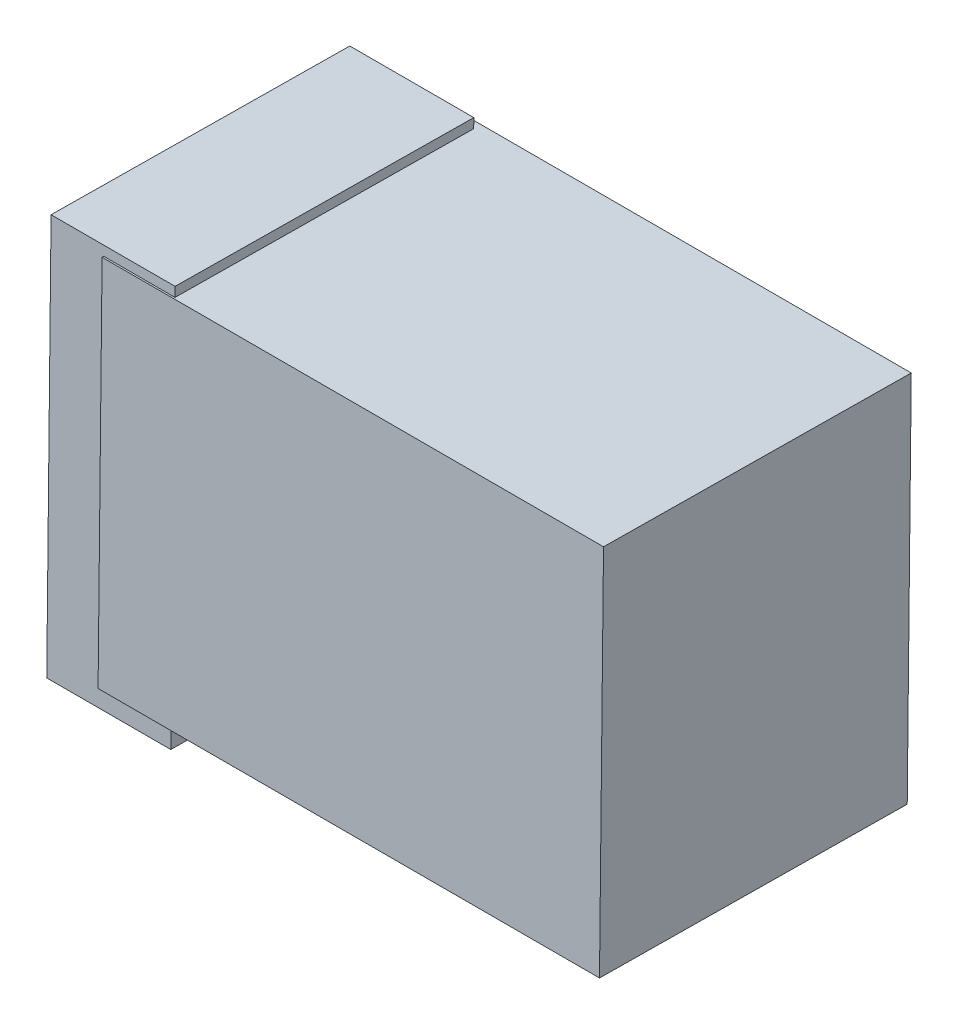
ISO-10303-21;
HEADER;
FILE_DESCRIPTION(('STEP AP214'),'2;1');
FILE_NAME('part.step','',(''),(''),'','','');
FILE_SCHEMA(('AUTOMOTIVE_DESIGN { 1 0 10303 214 1 1 1 1 }'));
ENDSEC;
DATA;
#1=APPLICATION_CONTEXT('core data for automotive mechanical design processes');
#2=APPLICATION_PROTOCOL_DEFINITION('international standard','automotive_design',2000,#1);
#3=PRODUCT_CONTEXT('',#1,'mechanical');
#4=PRODUCT('Part','Part','',(#3));
#5=PRODUCT_RELATED_PRODUCT_CATEGORY('part','',(#4));
#6=PRODUCT_DEFINITION_FORMATION('','',#4);
#7=PRODUCT_DEFINITION_CONTEXT('part definition',#1,'design');
#8=PRODUCT_DEFINITION('design','',#6,#7);
#9=PRODUCT_DEFINITION_SHAPE('','',#8);
#10=(LENGTH_UNIT() NAMED_UNIT(*) SI_UNIT(.MILLI.,.METRE.));
#11=(NAMED_UNIT(*) PLANE_ANGLE_UNIT() SI_UNIT($,.RADIAN.));
#12=(NAMED_UNIT(*) SI_UNIT($,.STERADIAN.) SOLID_ANGLE_UNIT());
#13=UNCERTAINTY_MEASURE_WITH_UNIT(LENGTH_MEASURE(1.E-05),#10,'distance_accuracy_value','');
#14=(GEOMETRIC_REPRESENTATION_CONTEXT(3) GLOBAL_UNCERTAINTY_ASSIGNED_CONTEXT((#13)) GLOBAL_UNIT_ASSIGNED_CONTEXT((#10,
#11,#12)) REPRESENTATION_CONTEXT('',''));
#15=CARTESIAN_POINT('',(0.,0.,0.));
#16=DIRECTION('',(0.,0.,1.));
#17=DIRECTION('',(1.,0.,0.));
#18=AXIS2_PLACEMENT_3D('',#15,#16,#17);
#19=CARTESIAN_POINT('',(-0.754112746694292,-230.239351571396,-489.224358288074));
#20=DIRECTION('',(0.,0.99994117985244,-0.0108460516000347));
#21=DIRECTION('',(0.,0.0108460516000347,0.99994117985244));
#22=AXIS2_PLACEMENT_3D('',#19,#20,#21);
#23=PLANE('',#22);
#24=DIRECTION('',(-1.,0.,0.));
#25=VECTOR('',#24,1.);
#26=CARTESIAN_POINT('',(-0.754112746694292,-230.239351571396,-489.224358288074));
#27=LINE('',#26,#25);
#28=CARTESIAN_POINT('',(46.4948174095008,-230.239351571396,-489.224358288074));
#29=VERTEX_POINT('',#28);
#30=CARTESIAN_POINT('',(-0.754112746694292,-230.239351571396,-489.224358288074));
#31=VERTEX_POINT('',#30);
#32=EDGE_CURVE('E66',#29,#31,#27,.T.);
#33=ORIENTED_EDGE('',*,*,#32,.T.);
#34=DIRECTION('',(0.,0.0108460516000347,0.99994117985244));
#35=VECTOR('',#34,1.);
#36=CARTESIAN_POINT('',(-0.754112746694292,-230.239351571396,-489.224358288074));
#37=LINE('',#36,#35);
#38=CARTESIAN_POINT('',(-0.754112746694299,-230.231885866891,-488.536064921346));
#39=VERTEX_POINT('',#38);
#40=EDGE_CURVE('E244',#31,#39,#37,.T.);
#41=ORIENTED_EDGE('',*,*,#40,.T.);
#42=DIRECTION('',(1.,0.,0.));
#43=VECTOR('',#42,1.);
#44=CARTESIAN_POINT('',(-0.754112746694292,-230.231885866891,-488.536064921346));
#45=LINE('',#44,#43);
#46=CARTESIAN_POINT('',(5.95286528143369,-230.231885866891,-488.536064921346));
#47=VERTEX_POINT('',#46);
#48=EDGE_CURVE('E203',#39,#47,#45,.T.);
#49=ORIENTED_EDGE('',*,*,#48,.T.);
#50=DIRECTION('',(0.,0.0108460516000347,0.99994117985244));
#51=VECTOR('',#50,1.);
#52=CARTESIAN_POINT('',(5.95286528143369,-230.239351571396,-489.224358288074));
#53=LINE('',#52,#51);
#54=CARTESIAN_POINT('',(5.95286528143369,-229.926561305229,-460.386963876532));
#55=VERTEX_POINT('',#54);
#56=EDGE_CURVE('E207',#47,#55,#53,.T.);
#57=ORIENTED_EDGE('',*,*,#56,.T.);
#58=DIRECTION('',(-1.,0.,0.));
#59=VECTOR('',#58,1.);
#60=CARTESIAN_POINT('',(-0.754112746694292,-229.926561305229,-460.386963876532));
#61=LINE('',#60,#59);
#62=CARTESIAN_POINT('',(-0.754112746694594,-229.926561305229,-460.386963876532));
#63=VERTEX_POINT('',#62);
#64=EDGE_CURVE('E215',#55,#63,#61,.T.);
#65=ORIENTED_EDGE('',*,*,#64,.T.);
#66=CARTESIAN_POINT('',(-0.754112746694596,-229.924816074995,-460.226064072353));
#67=VERTEX_POINT('',#66);
#68=EDGE_CURVE('E248',#63,#67,#37,.T.);
#69=ORIENTED_EDGE('',*,*,#68,.T.);
#70=DIRECTION('',(-1.,0.,0.));
#71=VECTOR('',#70,1.);
#72=CARTESIAN_POINT('',(-0.754112746694596,-229.924816074995,-460.226064072353));
#73=LINE('',#72,#71);
#74=CARTESIAN_POINT('',(46.4948174095005,-229.924816074995,-460.226064072353));
#75=VERTEX_POINT('',#74);
#76=EDGE_CURVE('E88',#75,#67,#73,.T.);
#77=ORIENTED_EDGE('',*,*,#76,.F.);
#78=DIRECTION('',(0.,0.0108460516000347,0.99994117985244));
#79=VECTOR('',#78,1.);
#80=CARTESIAN_POINT('',(46.4948174095008,-230.239351571396,-489.224358288074));
#81=LINE('',#80,#79);
#82=EDGE_CURVE('E249',#29,#75,#81,.T.);
#83=ORIENTED_EDGE('',*,*,#82,.F.);
#84=EDGE_LOOP('',(#33,#41,#49,#57,#65,#69,#77,#83));
#85=FACE_BOUND('',#84,.T.);
#86=ADVANCED_FACE('F41',(#85),#23,.T.);
#87=CARTESIAN_POINT('',(0.,-224.005918783108,2.42972267048032));
#88=DIRECTION('',(0.,-0.99994117985244,0.0108460516000327));
#89=DIRECTION('',(0.,-0.0108460516000327,-0.99994117985244));
#90=AXIS2_PLACEMENT_3D('',#87,#88,#89);
#91=PLANE('',#90);
#92=DIRECTION('',(1.,0.,0.));
#93=VECTOR('',#92,1.);
#94=CARTESIAN_POINT('',(5.95286528143369,-229.026053670927,-460.396731403327));
#95=LINE('',#94,#93);
#96=CARTESIAN_POINT('',(-5.73366114762707,-229.026053670927,-460.396731403327));
#97=VERTEX_POINT('',#96);
#98=CARTESIAN_POINT('',(5.95286528143369,-229.026053670927,-460.396731403327));
#99=VERTEX_POINT('',#98);
#100=EDGE_CURVE('E177',#97,#99,#95,.T.);
#101=ORIENTED_EDGE('',*,*,#100,.T.);
#102=DIRECTION('',(0.,-0.0108460516000327,-0.99994117985244));
#103=VECTOR('',#102,1.);
#104=CARTESIAN_POINT('',(5.95286528143369,-229.026053670927,-460.396731403327));
#105=LINE('',#104,#103);
#106=CARTESIAN_POINT('',(5.95286528143369,-229.331378232589,-488.545832448141));
#107=VERTEX_POINT('',#106);
#108=EDGE_CURVE('E181',#99,#107,#105,.T.);
#109=ORIENTED_EDGE('',*,*,#108,.T.);
#110=DIRECTION('',(-1.,0.,0.));
#111=VECTOR('',#110,1.);
#112=CARTESIAN_POINT('',(5.95286528143369,-229.331378232589,-488.545832448141));
#113=LINE('',#112,#111);
#114=CARTESIAN_POINT('',(-5.73366114762707,-229.331378232589,-488.545832448141));
#115=VERTEX_POINT('',#114);
#116=EDGE_CURVE('E184',#107,#115,#113,.T.);
#117=ORIENTED_EDGE('',*,*,#116,.T.);
#118=DIRECTION('',(0.,0.0108460516000327,0.99994117985244));
#119=VECTOR('',#118,1.);
#120=CARTESIAN_POINT('',(-5.73366114762707,-229.026053670927,-460.396731403327));
#121=LINE('',#120,#119);
#122=EDGE_CURVE('E187',#115,#97,#121,.T.);
#123=ORIENTED_EDGE('',*,*,#122,.T.);
#124=EDGE_LOOP('',(#101,#109,#117,#123));
#125=FACE_BOUND('',#124,.T.);
#126=ADVANCED_FACE('F276',(#125),#91,.F.);
#127=CARTESIAN_POINT('',(-5.73366114762707,-229.026053670927,-460.396731403327));
#128=DIRECTION('',(1.,0.,0.));
#129=DIRECTION('',(0.,1.,0.));
#130=AXIS2_PLACEMENT_3D('',#127,#128,#129);
#131=PLANE('',#130);
#132=DIRECTION('',(0.,-0.99994117985244,0.0108460516000326));
#133=VECTOR('',#132,1.);
#134=CARTESIAN_POINT('',(-5.73366114762707,-229.331378232589,-488.545832448141));
#135=LINE('',#134,#133);
#136=CARTESIAN_POINT('',(-5.73366114762701,-266.929166595041,-488.13802090798));
#137=VERTEX_POINT('',#136);
#138=EDGE_CURVE('E192',#115,#137,#135,.T.);
#139=ORIENTED_EDGE('',*,*,#138,.T.);
#140=DIRECTION('',(0.,0.0108460516000327,0.99994117985244));
#141=VECTOR('',#140,1.);
#142=CARTESIAN_POINT('',(-5.73366114762701,-266.623842033379,-459.988919863166));
#143=LINE('',#142,#141);
#144=CARTESIAN_POINT('',(-5.73366114762701,-266.623842033379,-459.988919863166));
#145=VERTEX_POINT('',#144);
#146=EDGE_CURVE('E174',#137,#145,#143,.T.);
#147=ORIENTED_EDGE('',*,*,#146,.T.);
#148=DIRECTION('',(0.,-0.99994117985244,0.0108460516000326));
#149=VECTOR('',#148,1.);
#150=CARTESIAN_POINT('',(-5.73366114762707,-229.026053670927,-460.396731403327));
#151=LINE('',#150,#149);
#152=EDGE_CURVE('E168',#97,#145,#151,.T.);
#153=ORIENTED_EDGE('',*,*,#152,.F.);
#154=ORIENTED_EDGE('',*,*,#122,.F.);
#155=EDGE_LOOP('',(#139,#147,#153,#154));
#156=FACE_BOUND('',#155,.T.);
#157=ADVANCED_FACE('F274',(#156),#131,.F.);
#158=CARTESIAN_POINT('',(0.,-261.603707145559,2.83753421064154));
#159=DIRECTION('',(0.,-0.99994117985244,0.0108460516000327));
#160=DIRECTION('',(0.,-0.0108460516000327,-0.99994117985244));
#161=AXIS2_PLACEMENT_3D('',#158,#159,#160);
#162=PLANE('',#161);
#163=DIRECTION('',(1.,0.,0.));
#164=VECTOR('',#163,1.);
#165=CARTESIAN_POINT('',(5.95286528143375,-266.623842033379,-459.988919863166));
#166=LINE('',#165,#164);
#167=CARTESIAN_POINT('',(5.95286528143375,-266.623842033379,-459.988919863166));
#168=VERTEX_POINT('',#167);
#169=EDGE_CURVE('E159',#145,#168,#166,.T.);
#170=ORIENTED_EDGE('',*,*,#169,.F.);
#171=ORIENTED_EDGE('',*,*,#146,.F.);
#172=DIRECTION('',(-1.,0.,0.));
#173=VECTOR('',#172,1.);
#174=CARTESIAN_POINT('',(5.95286528143375,-266.929166595041,-488.13802090798));
#175=LINE('',#174,#173);
#176=CARTESIAN_POINT('',(5.95286528143375,-266.929166595041,-488.13802090798));
#177=VERTEX_POINT('',#176);
#178=EDGE_CURVE('E162',#177,#137,#175,.T.);
#179=ORIENTED_EDGE('',*,*,#178,.F.);
#180=DIRECTION('',(0.,-0.0108460516000327,-0.99994117985244));
#181=VECTOR('',#180,1.);
#182=CARTESIAN_POINT('',(5.95286528143375,-266.623842033379,-459.988919863166));
#183=LINE('',#182,#181);
#184=EDGE_CURVE('E146',#168,#177,#183,.T.);
#185=ORIENTED_EDGE('',*,*,#184,.F.);
#186=EDGE_LOOP('',(#170,#171,#179,#185));
#187=FACE_BOUND('',#186,.T.);
#188=ADVANCED_FACE('F157',(#187),#162,.T.);
#189=CARTESIAN_POINT('',(5.95286528143369,-229.026053670927,-460.396731403327));
#190=DIRECTION('',(-1.,0.,0.));
#191=DIRECTION('',(0.,-1.,0.));
#192=AXIS2_PLACEMENT_3D('',#189,#190,#191);
#193=PLANE('',#192);
#194=DIRECTION('',(0.,-0.0108460516000347,-0.99994117985244));
#195=VECTOR('',#194,1.);
#196=CARTESIAN_POINT('',(5.95286528143375,-265.239252702523,-488.844725224337));
#197=LINE('',#196,#195);
#198=CARTESIAN_POINT('',(5.95286528143375,-264.926462436355,-460.007330812795));
#199=VERTEX_POINT('',#198);
#200=CARTESIAN_POINT('',(5.95286528143375,-265.231786998018,-488.156431857609));
#201=VERTEX_POINT('',#200);
#202=EDGE_CURVE('E50',#199,#201,#197,.T.);
#203=ORIENTED_EDGE('',*,*,#202,.F.);
#204=DIRECTION('',(0.,-0.99994117985244,0.0108460516000326));
#205=VECTOR('',#204,1.);
#206=CARTESIAN_POINT('',(5.95286528143369,-229.026053670927,-460.396731403327));
#207=LINE('',#206,#205);
#208=EDGE_CURVE('E142',#199,#168,#207,.T.);
#209=ORIENTED_EDGE('',*,*,#208,.T.);
#210=ORIENTED_EDGE('',*,*,#184,.T.);
#211=DIRECTION('',(0.,-0.99994117985244,0.0108460516000326));
#212=VECTOR('',#211,1.);
#213=CARTESIAN_POINT('',(5.95286528143369,-229.331378232589,-488.545832448141));
#214=LINE('',#213,#212);
#215=EDGE_CURVE('E195',#201,#177,#214,.T.);
#216=ORIENTED_EDGE('',*,*,#215,.F.);
#217=EDGE_LOOP('',(#203,#209,#210,#216));
#218=FACE_BOUND('',#217,.T.);
#219=ADVANCED_FACE('F144',(#218),#193,.F.);
#220=CARTESIAN_POINT('',(-0.754112746694292,-230.239351571396,-489.224358288074));
#221=DIRECTION('',(-1.,0.,0.));
#222=DIRECTION('',(0.,0.,1.));
#223=AXIS2_PLACEMENT_3D('',#220,#221,#222);
#224=PLANE('',#223);
#225=ORIENTED_EDGE('',*,*,#68,.F.);
#226=DIRECTION('',(0.,-0.99994117985244,0.0108460516000326));
#227=VECTOR('',#226,1.);
#228=CARTESIAN_POINT('',(-0.754112746694594,-229.926561305229,-460.386963876532));
#229=LINE('',#228,#227);
#230=CARTESIAN_POINT('',(-0.754112746694596,-264.926462436355,-460.007330812795));
#231=VERTEX_POINT('',#230);
#232=EDGE_CURVE('E211',#63,#231,#229,.T.);
#233=ORIENTED_EDGE('',*,*,#232,.T.);
#234=DIRECTION('',(0.,0.0108460516000347,0.99994117985244));
#235=VECTOR('',#234,1.);
#236=CARTESIAN_POINT('',(-0.754112746694292,-265.239252702523,-488.844725224337));
#237=LINE('',#236,#235);
#238=CARTESIAN_POINT('',(-0.754112746694596,-264.924717206122,-459.846431008616));
#239=VERTEX_POINT('',#238);
#240=EDGE_CURVE('E233',#231,#239,#237,.T.);
#241=ORIENTED_EDGE('',*,*,#240,.T.);
#242=DIRECTION('',(0.,-0.99994117985244,0.0108460516000356));
#243=VECTOR('',#242,1.);
#244=CARTESIAN_POINT('',(-0.754112746694596,-229.924816074995,-460.226064072353));
#245=LINE('',#244,#243);
#246=EDGE_CURVE('E219',#67,#239,#245,.T.);
#247=ORIENTED_EDGE('',*,*,#246,.F.);
#248=EDGE_LOOP('',(#225,#233,#241,#247));
#249=FACE_BOUND('',#248,.T.);
#250=ADVANCED_FACE('F43',(#249),#224,.T.);
#251=CARTESIAN_POINT('',(5.95286528143369,-229.026053670927,-460.396731403327));
#252=DIRECTION('',(0.,-0.0108460516000326,-0.99994117985244));
#253=DIRECTION('',(0.,0.99994117985244,-0.0108460516000326));
#254=AXIS2_PLACEMENT_3D('',#251,#252,#253);
#255=PLANE('',#254);
#256=ORIENTED_EDGE('',*,*,#64,.F.);
#257=EDGE_CURVE('E151',#99,#55,#207,.T.);
#258=ORIENTED_EDGE('',*,*,#257,.F.);
#259=ORIENTED_EDGE('',*,*,#100,.F.);
#260=ORIENTED_EDGE('',*,*,#152,.T.);
#261=ORIENTED_EDGE('',*,*,#169,.T.);
#262=ORIENTED_EDGE('',*,*,#208,.F.);
#263=DIRECTION('',(1.,0.,0.));
#264=VECTOR('',#263,1.);
#265=CARTESIAN_POINT('',(-0.754112746694292,-264.926462436355,-460.007330812795));
#266=LINE('',#265,#264);
#267=EDGE_CURVE('E11',#231,#199,#266,.T.);
#268=ORIENTED_EDGE('',*,*,#267,.F.);
#269=ORIENTED_EDGE('',*,*,#232,.F.);
#270=EDGE_LOOP('',(#256,#258,#259,#260,#261,#262,#268,#269));
#271=FACE_BOUND('',#270,.T.);
#272=ADVANCED_FACE('F165',(#271),#255,.F.);
#273=ORIENTED_EDGE('',*,*,#56,.F.);
#274=EDGE_CURVE('E152',#107,#47,#214,.T.);
#275=ORIENTED_EDGE('',*,*,#274,.F.);
#276=ORIENTED_EDGE('',*,*,#108,.F.);
#277=ORIENTED_EDGE('',*,*,#257,.T.);
#278=EDGE_LOOP('',(#273,#275,#276,#277));
#279=FACE_BOUND('',#278,.T.);
#280=ADVANCED_FACE('F355',(#279),#193,.F.);
#281=CARTESIAN_POINT('',(5.95286528143369,-229.331378232589,-488.545832448141));
#282=DIRECTION('',(0.,0.0108460516000326,0.99994117985244));
#283=DIRECTION('',(0.,-0.99994117985244,0.0108460516000326));
#284=AXIS2_PLACEMENT_3D('',#281,#282,#283);
#285=PLANE('',#284);
#286=ORIENTED_EDGE('',*,*,#48,.F.);
#287=DIRECTION('',(0.,0.99994117985244,-0.0108460516000326));
#288=VECTOR('',#287,1.);
#289=CARTESIAN_POINT('',(-0.754112746694299,-230.231885866891,-488.536064921346));
#290=LINE('',#289,#288);
#291=CARTESIAN_POINT('',(-0.754112746694299,-265.231786998018,-488.156431857609));
#292=VERTEX_POINT('',#291);
#293=EDGE_CURVE('E57',#292,#39,#290,.T.);
#294=ORIENTED_EDGE('',*,*,#293,.F.);
#295=DIRECTION('',(-1.,0.,0.));
#296=VECTOR('',#295,1.);
#297=CARTESIAN_POINT('',(-0.754112746694292,-265.231786998018,-488.156431857609));
#298=LINE('',#297,#296);
#299=EDGE_CURVE('E247',#201,#292,#298,.T.);
#300=ORIENTED_EDGE('',*,*,#299,.F.);
#301=ORIENTED_EDGE('',*,*,#215,.T.);
#302=ORIENTED_EDGE('',*,*,#178,.T.);
#303=ORIENTED_EDGE('',*,*,#138,.F.);
#304=ORIENTED_EDGE('',*,*,#116,.F.);
#305=ORIENTED_EDGE('',*,*,#274,.T.);
#306=EDGE_LOOP('',(#286,#294,#300,#301,#302,#303,#304,#305));
#307=FACE_BOUND('',#306,.T.);
#308=ADVANCED_FACE('F269',(#307),#285,.F.);
#309=CARTESIAN_POINT('',(-0.754112746694292,-265.239252702523,-488.844725224337));
#310=VERTEX_POINT('',#309);
#311=EDGE_CURVE('E95',#310,#292,#237,.T.);
#312=ORIENTED_EDGE('',*,*,#311,.T.);
#313=ORIENTED_EDGE('',*,*,#293,.T.);
#314=ORIENTED_EDGE('',*,*,#40,.F.);
#315=DIRECTION('',(0.,-0.99994117985244,0.0108460516000356));
#316=VECTOR('',#315,1.);
#317=CARTESIAN_POINT('',(-0.754112746694292,-230.239351571396,-489.224358288074));
#318=LINE('',#317,#316);
#319=EDGE_CURVE('E220',#31,#310,#318,.T.);
#320=ORIENTED_EDGE('',*,*,#319,.T.);
#321=EDGE_LOOP('',(#312,#313,#314,#320));
#322=FACE_BOUND('',#321,.T.);
#323=ADVANCED_FACE('F282',(#322),#224,.T.);
#324=CARTESIAN_POINT('',(46.4948174095008,-230.239351571396,-489.224358288074));
#325=DIRECTION('',(1.,0.,0.));
#326=DIRECTION('',(0.,0.,-1.));
#327=AXIS2_PLACEMENT_3D('',#324,#325,#326);
#328=PLANE('',#327);
#329=DIRECTION('',(0.,0.99994117985244,-0.0108460516000356));
#330=VECTOR('',#329,1.);
#331=CARTESIAN_POINT('',(46.4948174095005,-229.924816074995,-460.226064072353));
#332=LINE('',#331,#330);
#333=CARTESIAN_POINT('',(46.4948174095005,-264.924717206122,-459.846431008616));
#334=VERTEX_POINT('',#333);
#335=EDGE_CURVE('E239',#334,#75,#332,.T.);
#336=ORIENTED_EDGE('',*,*,#335,.F.);
#337=DIRECTION('',(0.,0.0108460516000347,0.99994117985244));
#338=VECTOR('',#337,1.);
#339=CARTESIAN_POINT('',(46.4948174095008,-265.239252702523,-488.844725224336));
#340=LINE('',#339,#338);
#341=CARTESIAN_POINT('',(46.4948174095008,-265.239252702523,-488.844725224336));
#342=VERTEX_POINT('',#341);
#343=EDGE_CURVE('E252',#342,#334,#340,.T.);
#344=ORIENTED_EDGE('',*,*,#343,.F.);
#345=DIRECTION('',(0.,0.99994117985244,-0.0108460516000356));
#346=VECTOR('',#345,1.);
#347=CARTESIAN_POINT('',(46.4948174095008,-230.239351571396,-489.224358288074));
#348=LINE('',#347,#346);
#349=EDGE_CURVE('E227',#342,#29,#348,.T.);
#350=ORIENTED_EDGE('',*,*,#349,.T.);
#351=ORIENTED_EDGE('',*,*,#82,.T.);
#352=EDGE_LOOP('',(#336,#344,#350,#351));
#353=FACE_BOUND('',#352,.T.);
#354=ADVANCED_FACE('F289',(#353),#328,.T.);
#355=CARTESIAN_POINT('',(4.89212934999521E-12,-5.01838965758767,-462.66555426963));
#356=DIRECTION('',(0.,0.0108460516000356,0.99994117985244));
#357=DIRECTION('',(0.,-0.99994117985244,0.0108460516000356));
#358=AXIS2_PLACEMENT_3D('',#355,#356,#357);
#359=PLANE('',#358);
#360=ORIENTED_EDGE('',*,*,#246,.T.);
#361=DIRECTION('',(1.,0.,0.));
#362=VECTOR('',#361,1.);
#363=CARTESIAN_POINT('',(-0.754112746694596,-264.924717206122,-459.846431008616));
#364=LINE('',#363,#362);
#365=EDGE_CURVE('E236',#239,#334,#364,.T.);
#366=ORIENTED_EDGE('',*,*,#365,.T.);
#367=ORIENTED_EDGE('',*,*,#335,.T.);
#368=ORIENTED_EDGE('',*,*,#76,.T.);
#369=EDGE_LOOP('',(#360,#366,#367,#368));
#370=FACE_BOUND('',#369,.T.);
#371=ADVANCED_FACE('F290',(#370),#359,.T.);
#372=CARTESIAN_POINT('',(5.19573957206769E-12,-5.33292515398868,-491.66384848535));
#373=DIRECTION('',(0.,0.0108460516000356,0.99994117985244));
#374=DIRECTION('',(0.,-0.99994117985244,0.0108460516000356));
#375=AXIS2_PLACEMENT_3D('',#372,#373,#374);
#376=PLANE('',#375);
#377=ORIENTED_EDGE('',*,*,#319,.F.);
#378=ORIENTED_EDGE('',*,*,#32,.F.);
#379=ORIENTED_EDGE('',*,*,#349,.F.);
#380=DIRECTION('',(1.,0.,0.));
#381=VECTOR('',#380,1.);
#382=CARTESIAN_POINT('',(-0.754112746694292,-265.239252702523,-488.844725224337));
#383=LINE('',#382,#381);
#384=EDGE_CURVE('E224',#310,#342,#383,.T.);
#385=ORIENTED_EDGE('',*,*,#384,.F.);
#386=EDGE_LOOP('',(#377,#378,#379,#385));
#387=FACE_BOUND('',#386,.T.);
#388=ADVANCED_FACE('F284',(#387),#376,.F.);
#389=CARTESIAN_POINT('',(-0.754112746694292,-265.239252702523,-488.844725224337));
#390=DIRECTION('',(0.,-0.99994117985244,0.0108460516000347));
#391=DIRECTION('',(0.,-0.0108460516000347,-0.99994117985244));
#392=AXIS2_PLACEMENT_3D('',#389,#390,#391);
#393=PLANE('',#392);
#394=ORIENTED_EDGE('',*,*,#343,.T.);
#395=ORIENTED_EDGE('',*,*,#365,.F.);
#396=ORIENTED_EDGE('',*,*,#240,.F.);
#397=ORIENTED_EDGE('',*,*,#267,.T.);
#398=ORIENTED_EDGE('',*,*,#202,.T.);
#399=ORIENTED_EDGE('',*,*,#299,.T.);
#400=ORIENTED_EDGE('',*,*,#311,.F.);
#401=ORIENTED_EDGE('',*,*,#384,.T.);
#402=EDGE_LOOP('',(#394,#395,#396,#397,#398,#399,#400,#401));
#403=FACE_BOUND('',#402,.T.);
#404=ADVANCED_FACE('F260',(#403),#393,.T.);
#405=CLOSED_SHELL('',(#86,#126,#157,#188,#219,#250,#272,#280,#308,#323,#354,#371,#388,#404));
#406=MANIFOLD_SOLID_BREP('B2',#405);
#407=ADVANCED_BREP_SHAPE_REPRESENTATION('',(#18,#406),#14);
#408=SHAPE_DEFINITION_REPRESENTATION(#9,#407);
ENDSEC;
END-ISO-10303-21;
